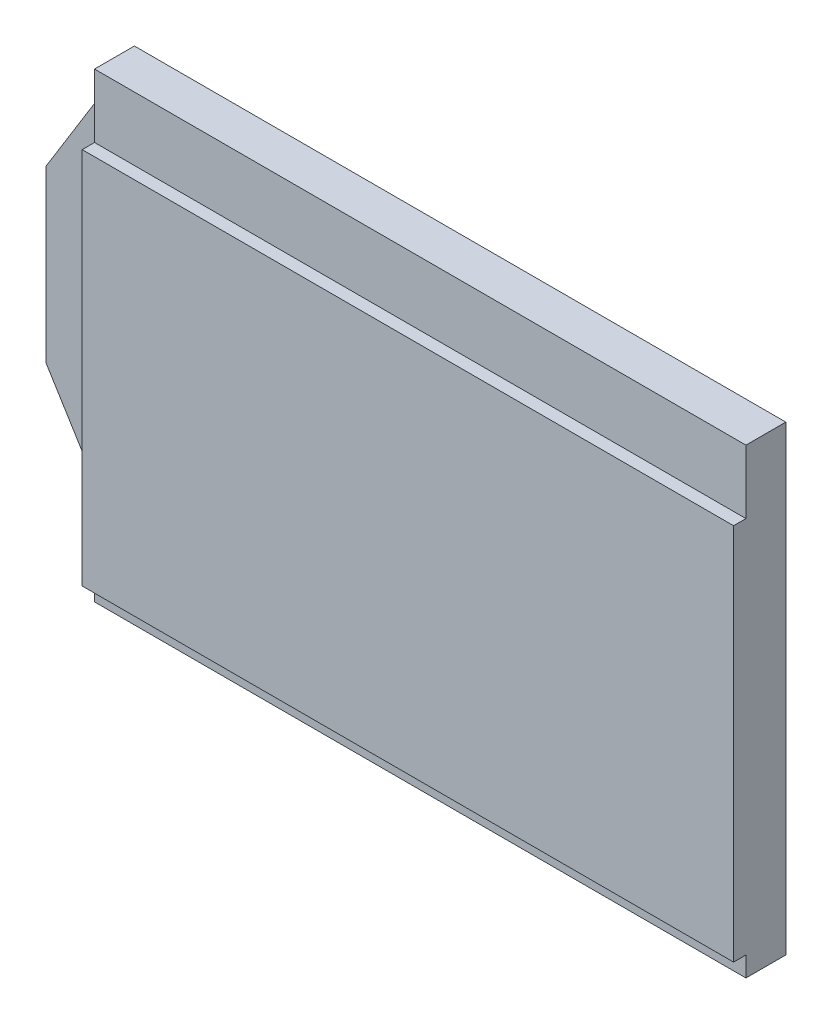
ISO-10303-21;
HEADER;
FILE_DESCRIPTION(('STEP AP214'),'2;1');
FILE_NAME('part.step','',(''),(''),'','','');
FILE_SCHEMA(('AUTOMOTIVE_DESIGN { 1 0 10303 214 1 1 1 1 }'));
ENDSEC;
DATA;
#1=APPLICATION_CONTEXT('core data for automotive mechanical design processes');
#2=APPLICATION_PROTOCOL_DEFINITION('international standard','automotive_design',2000,#1);
#3=PRODUCT_CONTEXT('',#1,'mechanical');
#4=PRODUCT('Part','Part','',(#3));
#5=PRODUCT_RELATED_PRODUCT_CATEGORY('part','',(#4));
#6=PRODUCT_DEFINITION_FORMATION('','',#4);
#7=PRODUCT_DEFINITION_CONTEXT('part definition',#1,'design');
#8=PRODUCT_DEFINITION('design','',#6,#7);
#9=PRODUCT_DEFINITION_SHAPE('','',#8);
#10=(LENGTH_UNIT() NAMED_UNIT(*) SI_UNIT(.MILLI.,.METRE.));
#11=(NAMED_UNIT(*) PLANE_ANGLE_UNIT() SI_UNIT($,.RADIAN.));
#12=(NAMED_UNIT(*) SI_UNIT($,.STERADIAN.) SOLID_ANGLE_UNIT());
#13=UNCERTAINTY_MEASURE_WITH_UNIT(LENGTH_MEASURE(1.E-05),#10,'distance_accuracy_value','');
#14=(GEOMETRIC_REPRESENTATION_CONTEXT(3) GLOBAL_UNCERTAINTY_ASSIGNED_CONTEXT((#13)) GLOBAL_UNIT_ASSIGNED_CONTEXT((#10,
#11,#12)) REPRESENTATION_CONTEXT('',''));
#15=CARTESIAN_POINT('',(0.,0.,0.));
#16=DIRECTION('',(0.,0.,1.));
#17=DIRECTION('',(1.,0.,0.));
#18=AXIS2_PLACEMENT_3D('',#15,#16,#17);
#19=CARTESIAN_POINT('',(-34.3,22.2188631922187,2.5));
#20=DIRECTION('',(1.,0.,0.));
#21=DIRECTION('',(0.,1.,0.));
#22=AXIS2_PLACEMENT_3D('',#19,#20,#21);
#23=PLANE('',#22);
#24=DIRECTION('',(0.,-1.,0.));
#25=VECTOR('',#24,1.);
#26=CARTESIAN_POINT('',(-34.3,22.2188631922187,0.));
#27=LINE('',#26,#25);
#28=CARTESIAN_POINT('',(-34.3,22.2188631922187,0.));
#29=VERTEX_POINT('',#28);
#30=CARTESIAN_POINT('',(-34.3,-17.7811368077813,0.));
#31=VERTEX_POINT('',#30);
#32=EDGE_CURVE('E108',#29,#31,#27,.T.);
#33=ORIENTED_EDGE('',*,*,#32,.F.);
#34=DIRECTION('',(0.,0.,-1.));
#35=VECTOR('',#34,1.);
#36=CARTESIAN_POINT('',(-34.3,22.2188631922187,2.5));
#37=LINE('',#36,#35);
#38=CARTESIAN_POINT('',(-34.3,22.2188631922187,2.5));
#39=VERTEX_POINT('',#38);
#40=EDGE_CURVE('E12',#39,#29,#37,.T.);
#41=ORIENTED_EDGE('',*,*,#40,.F.);
#42=DIRECTION('',(0.,-1.,0.));
#43=VECTOR('',#42,1.);
#44=CARTESIAN_POINT('',(-34.3,22.2188631922187,2.5));
#45=LINE('',#44,#43);
#46=CARTESIAN_POINT('',(-34.3,-17.7811368077813,2.5));
#47=VERTEX_POINT('',#46);
#48=EDGE_CURVE('E102',#39,#47,#45,.T.);
#49=ORIENTED_EDGE('',*,*,#48,.T.);
#50=DIRECTION('',(0.,0.,-1.));
#51=VECTOR('',#50,1.);
#52=CARTESIAN_POINT('',(-34.3,-17.7811368077813,2.5));
#53=LINE('',#52,#51);
#54=EDGE_CURVE('E47',#47,#31,#53,.T.);
#55=ORIENTED_EDGE('',*,*,#54,.T.);
#56=EDGE_LOOP('',(#33,#41,#49,#55));
#57=FACE_BOUND('',#56,.T.);
#58=ADVANCED_FACE('F44',(#57),#23,.T.);
#59=CARTESIAN_POINT('',(-34.3,22.2188631922187,2.5));
#60=DIRECTION('',(-0.850927467972543,0.525283203852776,0.));
#61=DIRECTION('',(-0.525283203852776,-0.850927467972543,0.));
#62=AXIS2_PLACEMENT_3D('',#59,#60,#61);
#63=PLANE('',#62);
#64=DIRECTION('',(0.525283203852776,0.850927467972543,0.));
#65=VECTOR('',#64,1.);
#66=CARTESIAN_POINT('',(-34.3,22.2188631922187,0.));
#67=LINE('',#66,#65);
#68=CARTESIAN_POINT('',(-41.090373398273,11.2188631922187,0.));
#69=VERTEX_POINT('',#68);
#70=EDGE_CURVE('E104',#69,#29,#67,.T.);
#71=ORIENTED_EDGE('',*,*,#70,.F.);
#72=DIRECTION('',(0.,0.,-1.));
#73=VECTOR('',#72,1.);
#74=CARTESIAN_POINT('',(-41.090373398273,11.2188631922187,2.5));
#75=LINE('',#74,#73);
#76=CARTESIAN_POINT('',(-41.090373398273,11.2188631922187,2.5));
#77=VERTEX_POINT('',#76);
#78=EDGE_CURVE('E53',#77,#69,#75,.T.);
#79=ORIENTED_EDGE('',*,*,#78,.F.);
#80=DIRECTION('',(0.525283203852776,0.850927467972543,0.));
#81=VECTOR('',#80,1.);
#82=CARTESIAN_POINT('',(-34.3,22.2188631922187,2.5));
#83=LINE('',#82,#81);
#84=EDGE_CURVE('E99',#77,#39,#83,.T.);
#85=ORIENTED_EDGE('',*,*,#84,.T.);
#86=ORIENTED_EDGE('',*,*,#40,.T.);
#87=EDGE_LOOP('',(#71,#79,#85,#86));
#88=FACE_BOUND('',#87,.T.);
#89=ADVANCED_FACE('F118',(#88),#63,.T.);
#90=CARTESIAN_POINT('',(-41.090373398273,11.2188631922187,2.5));
#91=DIRECTION('',(-1.,0.,0.));
#92=DIRECTION('',(0.,0.,1.));
#93=AXIS2_PLACEMENT_3D('',#90,#91,#92);
#94=PLANE('',#93);
#95=DIRECTION('',(0.,1.,0.));
#96=VECTOR('',#95,1.);
#97=CARTESIAN_POINT('',(-41.090373398273,11.2188631922187,0.));
#98=LINE('',#97,#96);
#99=CARTESIAN_POINT('',(-41.090373398273,-6.78113680778131,0.));
#100=VERTEX_POINT('',#99);
#101=EDGE_CURVE('E94',#100,#69,#98,.T.);
#102=ORIENTED_EDGE('',*,*,#101,.F.);
#103=DIRECTION('',(0.,0.,-1.));
#104=VECTOR('',#103,1.);
#105=CARTESIAN_POINT('',(-41.090373398273,-6.78113680778131,2.5));
#106=LINE('',#105,#104);
#107=CARTESIAN_POINT('',(-41.090373398273,-6.78113680778131,2.5));
#108=VERTEX_POINT('',#107);
#109=EDGE_CURVE('E89',#108,#100,#106,.T.);
#110=ORIENTED_EDGE('',*,*,#109,.F.);
#111=DIRECTION('',(0.,1.,0.));
#112=VECTOR('',#111,1.);
#113=CARTESIAN_POINT('',(-41.090373398273,11.2188631922187,2.5));
#114=LINE('',#113,#112);
#115=EDGE_CURVE('E92',#108,#77,#114,.T.);
#116=ORIENTED_EDGE('',*,*,#115,.T.);
#117=ORIENTED_EDGE('',*,*,#78,.T.);
#118=EDGE_LOOP('',(#102,#110,#116,#117));
#119=FACE_BOUND('',#118,.T.);
#120=ADVANCED_FACE('F91',(#119),#94,.T.);
#121=CARTESIAN_POINT('',(-34.3,-17.7811368077813,2.5));
#122=DIRECTION('',(-0.850927467972544,-0.525283203852775,0.));
#123=DIRECTION('',(0.525283203852775,-0.850927467972544,0.));
#124=AXIS2_PLACEMENT_3D('',#121,#122,#123);
#125=PLANE('',#124);
#126=DIRECTION('',(-0.525283203852775,0.850927467972544,0.));
#127=VECTOR('',#126,1.);
#128=CARTESIAN_POINT('',(-34.3,-17.7811368077813,0.));
#129=LINE('',#128,#127);
#130=EDGE_CURVE('E111',#31,#100,#129,.T.);
#131=ORIENTED_EDGE('',*,*,#130,.F.);
#132=ORIENTED_EDGE('',*,*,#54,.F.);
#133=DIRECTION('',(-0.525283203852775,0.850927467972544,0.));
#134=VECTOR('',#133,1.);
#135=CARTESIAN_POINT('',(-34.3,-17.7811368077813,2.5));
#136=LINE('',#135,#134);
#137=EDGE_CURVE('E98',#47,#108,#136,.T.);
#138=ORIENTED_EDGE('',*,*,#137,.T.);
#139=ORIENTED_EDGE('',*,*,#109,.T.);
#140=EDGE_LOOP('',(#131,#132,#138,#139));
#141=FACE_BOUND('',#140,.T.);
#142=ADVANCED_FACE('F101',(#141),#125,.T.);
#143=CARTESIAN_POINT('',(0.,0.,2.5));
#144=DIRECTION('',(0.,0.,-1.));
#145=DIRECTION('',(-1.,0.,0.));
#146=AXIS2_PLACEMENT_3D('',#143,#144,#145);
#147=PLANE('',#146);
#148=ORIENTED_EDGE('',*,*,#48,.F.);
#149=ORIENTED_EDGE('',*,*,#84,.F.);
#150=ORIENTED_EDGE('',*,*,#115,.F.);
#151=ORIENTED_EDGE('',*,*,#137,.F.);
#152=EDGE_LOOP('',(#148,#149,#150,#151));
#153=FACE_BOUND('',#152,.T.);
#154=ADVANCED_FACE('F97',(#153),#147,.F.);
#155=CARTESIAN_POINT('',(0.,0.,0.));
#156=DIRECTION('',(0.,0.,-1.));
#157=DIRECTION('',(-1.,0.,0.));
#158=AXIS2_PLACEMENT_3D('',#155,#156,#157);
#159=PLANE('',#158);
#160=ORIENTED_EDGE('',*,*,#32,.T.);
#161=ORIENTED_EDGE('',*,*,#130,.T.);
#162=ORIENTED_EDGE('',*,*,#101,.T.);
#163=ORIENTED_EDGE('',*,*,#70,.T.);
#164=EDGE_LOOP('',(#160,#161,#162,#163));
#165=FACE_BOUND('',#164,.T.);
#166=ADVANCED_FACE('F117',(#165),#159,.T.);
#167=CLOSED_SHELL('',(#58,#89,#120,#142,#154,#166));
#168=MANIFOLD_SOLID_BREP('B2',#167);
#169=CARTESIAN_POINT('',(0.,0.,4.2));
#170=DIRECTION('',(0.,0.,1.));
#171=DIRECTION('',(1.,0.,0.));
#172=AXIS2_PLACEMENT_3D('',#169,#170,#171);
#173=PLANE('',#172);
#174=DIRECTION('',(-1.,0.,0.));
#175=VECTOR('',#174,1.);
#176=CARTESIAN_POINT('',(-34.3,17.6,4.2));
#177=LINE('',#176,#175);
#178=CARTESIAN_POINT('',(34.3,17.6,4.2));
#179=VERTEX_POINT('',#178);
#180=CARTESIAN_POINT('',(-34.3,17.6,4.2));
#181=VERTEX_POINT('',#180);
#182=EDGE_CURVE('E251',#179,#181,#177,.T.);
#183=ORIENTED_EDGE('',*,*,#182,.F.);
#184=DIRECTION('',(0.,1.,0.));
#185=VECTOR('',#184,1.);
#186=CARTESIAN_POINT('',(34.3,24.3,4.2));
#187=LINE('',#186,#185);
#188=CARTESIAN_POINT('',(34.3,24.3,4.2));
#189=VERTEX_POINT('',#188);
#190=EDGE_CURVE('E268',#179,#189,#187,.T.);
#191=ORIENTED_EDGE('',*,*,#190,.T.);
#192=DIRECTION('',(-1.,0.,0.));
#193=VECTOR('',#192,1.);
#194=CARTESIAN_POINT('',(-34.3,24.3,4.2));
#195=LINE('',#194,#193);
#196=CARTESIAN_POINT('',(-34.3,24.3,4.2));
#197=VERTEX_POINT('',#196);
#198=EDGE_CURVE('E267',#189,#197,#195,.T.);
#199=ORIENTED_EDGE('',*,*,#198,.T.);
#200=DIRECTION('',(0.,-1.,0.));
#201=VECTOR('',#200,1.);
#202=CARTESIAN_POINT('',(-34.3,24.3,4.2));
#203=LINE('',#202,#201);
#204=EDGE_CURVE('E190',#197,#181,#203,.T.);
#205=ORIENTED_EDGE('',*,*,#204,.T.);
#206=EDGE_LOOP('',(#183,#191,#199,#205));
#207=FACE_BOUND('',#206,.T.);
#208=ADVANCED_FACE('F167',(#207),#173,.T.);
#209=CARTESIAN_POINT('',(34.3,24.3,4.2));
#210=DIRECTION('',(-1.,0.,0.));
#211=DIRECTION('',(0.,-1.,0.));
#212=AXIS2_PLACEMENT_3D('',#209,#210,#211);
#213=PLANE('',#212);
#214=DIRECTION('',(0.,1.,0.));
#215=VECTOR('',#214,1.);
#216=CARTESIAN_POINT('',(34.3,24.3,0.));
#217=LINE('',#216,#215);
#218=CARTESIAN_POINT('',(34.3,-24.3,0.));
#219=VERTEX_POINT('',#218);
#220=CARTESIAN_POINT('',(34.3,24.3,0.));
#221=VERTEX_POINT('',#220);
#222=EDGE_CURVE('E256',#219,#221,#217,.T.);
#223=ORIENTED_EDGE('',*,*,#222,.T.);
#224=DIRECTION('',(0.,0.,-1.));
#225=VECTOR('',#224,1.);
#226=CARTESIAN_POINT('',(34.3,24.3,4.2));
#227=LINE('',#226,#225);
#228=EDGE_CURVE('E42',#189,#221,#227,.T.);
#229=ORIENTED_EDGE('',*,*,#228,.F.);
#230=ORIENTED_EDGE('',*,*,#190,.F.);
#231=DIRECTION('',(0.,0.,-1.));
#232=VECTOR('',#231,1.);
#233=CARTESIAN_POINT('',(34.3,17.6,5.5));
#234=LINE('',#233,#232);
#235=CARTESIAN_POINT('',(34.3,17.6,5.5));
#236=VERTEX_POINT('',#235);
#237=EDGE_CURVE('E261',#236,#179,#234,.T.);
#238=ORIENTED_EDGE('',*,*,#237,.F.);
#239=DIRECTION('',(0.,1.,0.));
#240=VECTOR('',#239,1.);
#241=CARTESIAN_POINT('',(34.3,-22.2,5.5));
#242=LINE('',#241,#240);
#243=CARTESIAN_POINT('',(34.3,-22.2,5.5));
#244=VERTEX_POINT('',#243);
#245=EDGE_CURVE('E241',#244,#236,#242,.T.);
#246=ORIENTED_EDGE('',*,*,#245,.F.);
#247=DIRECTION('',(0.,0.,-1.));
#248=VECTOR('',#247,1.);
#249=CARTESIAN_POINT('',(34.3,-22.2,5.5));
#250=LINE('',#249,#248);
#251=CARTESIAN_POINT('',(34.3,-22.2,4.2));
#252=VERTEX_POINT('',#251);
#253=EDGE_CURVE('E238',#244,#252,#250,.T.);
#254=ORIENTED_EDGE('',*,*,#253,.T.);
#255=CARTESIAN_POINT('',(34.3,-24.3,4.2));
#256=VERTEX_POINT('',#255);
#257=EDGE_CURVE('E265',#256,#252,#187,.T.);
#258=ORIENTED_EDGE('',*,*,#257,.F.);
#259=DIRECTION('',(0.,0.,-1.));
#260=VECTOR('',#259,1.);
#261=CARTESIAN_POINT('',(34.3,-24.3,4.2));
#262=LINE('',#261,#260);
#263=EDGE_CURVE('E272',#256,#219,#262,.T.);
#264=ORIENTED_EDGE('',*,*,#263,.T.);
#265=EDGE_LOOP('',(#223,#229,#230,#238,#246,#254,#258,#264));
#266=FACE_BOUND('',#265,.T.);
#267=ADVANCED_FACE('F169',(#266),#213,.F.);
#268=CARTESIAN_POINT('',(-34.3,24.3,4.2));
#269=DIRECTION('',(0.,-1.,0.));
#270=DIRECTION('',(0.,0.,-1.));
#271=AXIS2_PLACEMENT_3D('',#268,#269,#270);
#272=PLANE('',#271);
#273=DIRECTION('',(-1.,0.,0.));
#274=VECTOR('',#273,1.);
#275=CARTESIAN_POINT('',(-34.3,24.3,0.));
#276=LINE('',#275,#274);
#277=CARTESIAN_POINT('',(-34.3,24.3,0.));
#278=VERTEX_POINT('',#277);
#279=EDGE_CURVE('E259',#221,#278,#276,.T.);
#280=ORIENTED_EDGE('',*,*,#279,.T.);
#281=DIRECTION('',(0.,0.,-1.));
#282=VECTOR('',#281,1.);
#283=CARTESIAN_POINT('',(-34.3,24.3,4.2));
#284=LINE('',#283,#282);
#285=EDGE_CURVE('E175',#197,#278,#284,.T.);
#286=ORIENTED_EDGE('',*,*,#285,.F.);
#287=ORIENTED_EDGE('',*,*,#198,.F.);
#288=ORIENTED_EDGE('',*,*,#228,.T.);
#289=EDGE_LOOP('',(#280,#286,#287,#288));
#290=FACE_BOUND('',#289,.T.);
#291=ADVANCED_FACE('F311',(#290),#272,.F.);
#292=CARTESIAN_POINT('',(-34.3,24.3,4.2));
#293=DIRECTION('',(1.,0.,0.));
#294=DIRECTION('',(0.,1.,0.));
#295=AXIS2_PLACEMENT_3D('',#292,#293,#294);
#296=PLANE('',#295);
#297=DIRECTION('',(0.,-1.,0.));
#298=VECTOR('',#297,1.);
#299=CARTESIAN_POINT('',(-34.3,24.3,0.));
#300=LINE('',#299,#298);
#301=CARTESIAN_POINT('',(-34.3,-24.3,0.));
#302=VERTEX_POINT('',#301);
#303=EDGE_CURVE('E275',#278,#302,#300,.T.);
#304=ORIENTED_EDGE('',*,*,#303,.T.);
#305=DIRECTION('',(0.,0.,-1.));
#306=VECTOR('',#305,1.);
#307=CARTESIAN_POINT('',(-34.3,-24.3,4.2));
#308=LINE('',#307,#306);
#309=CARTESIAN_POINT('',(-34.3,-24.3,4.2));
#310=VERTEX_POINT('',#309);
#311=EDGE_CURVE('E281',#310,#302,#308,.T.);
#312=ORIENTED_EDGE('',*,*,#311,.F.);
#313=CARTESIAN_POINT('',(-34.3,-22.2,4.2));
#314=VERTEX_POINT('',#313);
#315=EDGE_CURVE('E255',#314,#310,#203,.T.);
#316=ORIENTED_EDGE('',*,*,#315,.F.);
#317=DIRECTION('',(0.,0.,-1.));
#318=VECTOR('',#317,1.);
#319=CARTESIAN_POINT('',(-34.3,-22.2,5.5));
#320=LINE('',#319,#318);
#321=CARTESIAN_POINT('',(-34.3,-22.2,5.5));
#322=VERTEX_POINT('',#321);
#323=EDGE_CURVE('E236',#322,#314,#320,.T.);
#324=ORIENTED_EDGE('',*,*,#323,.F.);
#325=DIRECTION('',(0.,-1.,0.));
#326=VECTOR('',#325,1.);
#327=CARTESIAN_POINT('',(-34.3,-22.2,5.5));
#328=LINE('',#327,#326);
#329=CARTESIAN_POINT('',(-34.3,17.6,5.5));
#330=VERTEX_POINT('',#329);
#331=EDGE_CURVE('E242',#330,#322,#328,.T.);
#332=ORIENTED_EDGE('',*,*,#331,.F.);
#333=DIRECTION('',(0.,0.,-1.));
#334=VECTOR('',#333,1.);
#335=CARTESIAN_POINT('',(-34.3,17.6,5.5));
#336=LINE('',#335,#334);
#337=EDGE_CURVE('E305',#330,#181,#336,.T.);
#338=ORIENTED_EDGE('',*,*,#337,.T.);
#339=ORIENTED_EDGE('',*,*,#204,.F.);
#340=ORIENTED_EDGE('',*,*,#285,.T.);
#341=EDGE_LOOP('',(#304,#312,#316,#324,#332,#338,#339,#340));
#342=FACE_BOUND('',#341,.T.);
#343=ADVANCED_FACE('F253',(#342),#296,.F.);
#344=CARTESIAN_POINT('',(-34.3,-24.3,4.2));
#345=DIRECTION('',(0.,1.,0.));
#346=DIRECTION('',(0.,0.,1.));
#347=AXIS2_PLACEMENT_3D('',#344,#345,#346);
#348=PLANE('',#347);
#349=DIRECTION('',(1.,0.,0.));
#350=VECTOR('',#349,1.);
#351=CARTESIAN_POINT('',(-34.3,-24.3,0.));
#352=LINE('',#351,#350);
#353=EDGE_CURVE('E277',#302,#219,#352,.T.);
#354=ORIENTED_EDGE('',*,*,#353,.T.);
#355=ORIENTED_EDGE('',*,*,#263,.F.);
#356=DIRECTION('',(1.,0.,0.));
#357=VECTOR('',#356,1.);
#358=CARTESIAN_POINT('',(-34.3,-24.3,4.2));
#359=LINE('',#358,#357);
#360=EDGE_CURVE('E271',#310,#256,#359,.T.);
#361=ORIENTED_EDGE('',*,*,#360,.F.);
#362=ORIENTED_EDGE('',*,*,#311,.T.);
#363=EDGE_LOOP('',(#354,#355,#361,#362));
#364=FACE_BOUND('',#363,.T.);
#365=ADVANCED_FACE('F294',(#364),#348,.F.);
#366=DIRECTION('',(1.,0.,0.));
#367=VECTOR('',#366,1.);
#368=CARTESIAN_POINT('',(-34.3,-22.2,4.2));
#369=LINE('',#368,#367);
#370=EDGE_CURVE('E182',#314,#252,#369,.T.);
#371=ORIENTED_EDGE('',*,*,#370,.F.);
#372=ORIENTED_EDGE('',*,*,#315,.T.);
#373=ORIENTED_EDGE('',*,*,#360,.T.);
#374=ORIENTED_EDGE('',*,*,#257,.T.);
#375=EDGE_LOOP('',(#371,#372,#373,#374));
#376=FACE_BOUND('',#375,.T.);
#377=ADVANCED_FACE('F299',(#376),#173,.T.);
#378=CARTESIAN_POINT('',(0.,0.,0.));
#379=DIRECTION('',(0.,0.,1.));
#380=DIRECTION('',(1.,0.,0.));
#381=AXIS2_PLACEMENT_3D('',#378,#379,#380);
#382=PLANE('',#381);
#383=ORIENTED_EDGE('',*,*,#222,.F.);
#384=ORIENTED_EDGE('',*,*,#353,.F.);
#385=ORIENTED_EDGE('',*,*,#303,.F.);
#386=ORIENTED_EDGE('',*,*,#279,.F.);
#387=EDGE_LOOP('',(#383,#384,#385,#386));
#388=FACE_BOUND('',#387,.T.);
#389=ADVANCED_FACE('F291',(#388),#382,.F.);
#390=CARTESIAN_POINT('',(-34.3,-22.2,5.5));
#391=DIRECTION('',(0.,1.,0.));
#392=DIRECTION('',(0.,0.,1.));
#393=AXIS2_PLACEMENT_3D('',#390,#391,#392);
#394=PLANE('',#393);
#395=ORIENTED_EDGE('',*,*,#370,.T.);
#396=ORIENTED_EDGE('',*,*,#253,.F.);
#397=DIRECTION('',(1.,0.,0.));
#398=VECTOR('',#397,1.);
#399=CARTESIAN_POINT('',(-34.3,-22.2,5.5));
#400=LINE('',#399,#398);
#401=EDGE_CURVE('E232',#322,#244,#400,.T.);
#402=ORIENTED_EDGE('',*,*,#401,.F.);
#403=ORIENTED_EDGE('',*,*,#323,.T.);
#404=EDGE_LOOP('',(#395,#396,#402,#403));
#405=FACE_BOUND('',#404,.T.);
#406=ADVANCED_FACE('F234',(#405),#394,.F.);
#407=CARTESIAN_POINT('',(-34.3,17.6,5.5));
#408=DIRECTION('',(0.,-1.,0.));
#409=DIRECTION('',(0.,0.,-1.));
#410=AXIS2_PLACEMENT_3D('',#407,#408,#409);
#411=PLANE('',#410);
#412=ORIENTED_EDGE('',*,*,#182,.T.);
#413=ORIENTED_EDGE('',*,*,#337,.F.);
#414=DIRECTION('',(-1.,0.,0.));
#415=VECTOR('',#414,1.);
#416=CARTESIAN_POINT('',(-34.3,17.6,5.5));
#417=LINE('',#416,#415);
#418=EDGE_CURVE('E247',#236,#330,#417,.T.);
#419=ORIENTED_EDGE('',*,*,#418,.F.);
#420=ORIENTED_EDGE('',*,*,#237,.T.);
#421=EDGE_LOOP('',(#412,#413,#419,#420));
#422=FACE_BOUND('',#421,.T.);
#423=ADVANCED_FACE('F309',(#422),#411,.F.);
#424=CARTESIAN_POINT('',(0.,0.,5.5));
#425=DIRECTION('',(0.,0.,-1.));
#426=DIRECTION('',(-1.,0.,0.));
#427=AXIS2_PLACEMENT_3D('',#424,#425,#426);
#428=PLANE('',#427);
#429=ORIENTED_EDGE('',*,*,#331,.T.);
#430=ORIENTED_EDGE('',*,*,#401,.T.);
#431=ORIENTED_EDGE('',*,*,#245,.T.);
#432=ORIENTED_EDGE('',*,*,#418,.T.);
#433=EDGE_LOOP('',(#429,#430,#431,#432));
#434=FACE_BOUND('',#433,.T.);
#435=ADVANCED_FACE('F245',(#434),#428,.F.);
#436=CLOSED_SHELL('',(#208,#267,#291,#343,#365,#377,#389,#406,#423,#435));
#437=MANIFOLD_SOLID_BREP('B6',#436);
#438=ADVANCED_BREP_SHAPE_REPRESENTATION('',(#18,#168,#437),#14);
#439=SHAPE_DEFINITION_REPRESENTATION(#9,#438);
ENDSEC;
END-ISO-10303-21;
